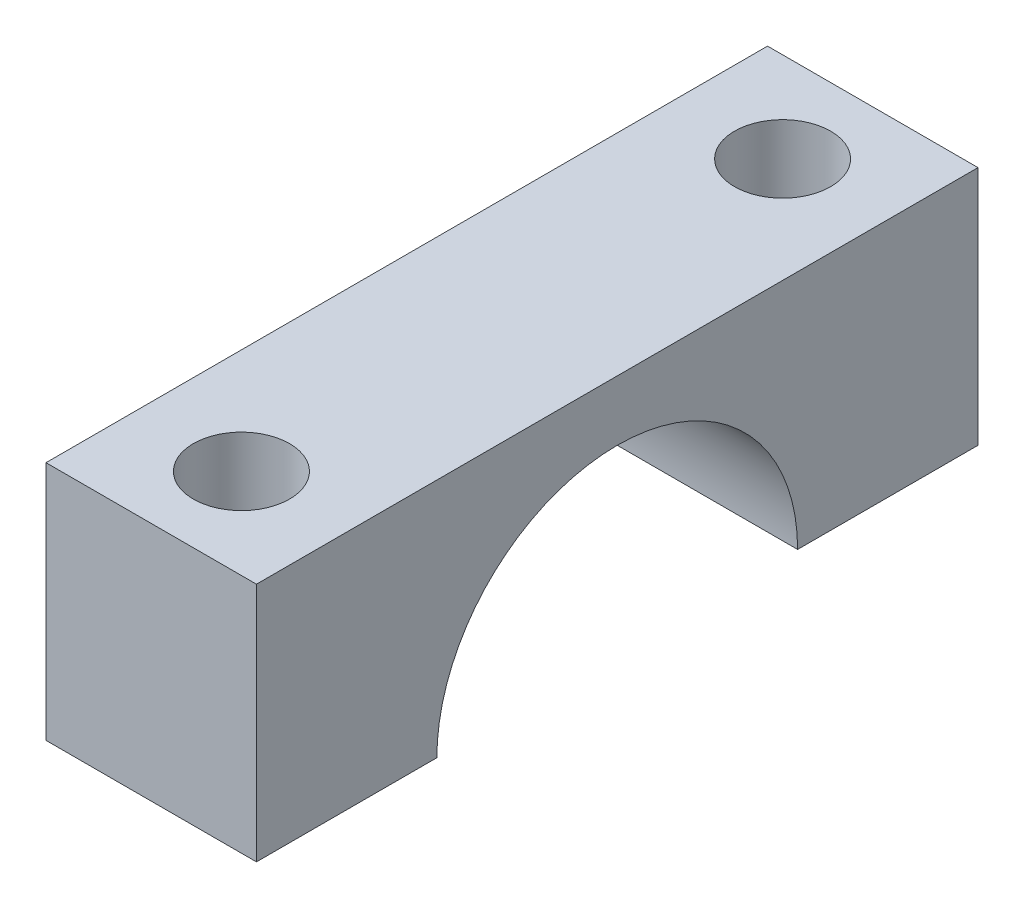
ISO-10303-21;
HEADER;
FILE_DESCRIPTION(('STEP AP214'),'2;1');
FILE_NAME('part.step','',(''),(''),'','','');
FILE_SCHEMA(('AUTOMOTIVE_DESIGN { 1 0 10303 214 1 1 1 1 }'));
ENDSEC;
DATA;
#1=APPLICATION_CONTEXT('core data for automotive mechanical design processes');
#2=APPLICATION_PROTOCOL_DEFINITION('international standard','automotive_design',2000,#1);
#3=PRODUCT_CONTEXT('',#1,'mechanical');
#4=PRODUCT('Part','Part','',(#3));
#5=PRODUCT_RELATED_PRODUCT_CATEGORY('part','',(#4));
#6=PRODUCT_DEFINITION_FORMATION('','',#4);
#7=PRODUCT_DEFINITION_CONTEXT('part definition',#1,'design');
#8=PRODUCT_DEFINITION('design','',#6,#7);
#9=PRODUCT_DEFINITION_SHAPE('','',#8);
#10=(LENGTH_UNIT() NAMED_UNIT(*) SI_UNIT(.MILLI.,.METRE.));
#11=(NAMED_UNIT(*) PLANE_ANGLE_UNIT() SI_UNIT($,.RADIAN.));
#12=(NAMED_UNIT(*) SI_UNIT($,.STERADIAN.) SOLID_ANGLE_UNIT());
#13=UNCERTAINTY_MEASURE_WITH_UNIT(LENGTH_MEASURE(1.E-05),#10,'distance_accuracy_value','');
#14=(GEOMETRIC_REPRESENTATION_CONTEXT(3) GLOBAL_UNCERTAINTY_ASSIGNED_CONTEXT((#13)) GLOBAL_UNIT_ASSIGNED_CONTEXT((#10,
#11,#12)) REPRESENTATION_CONTEXT('',''));
#15=CARTESIAN_POINT('',(0.,0.,0.));
#16=DIRECTION('',(0.,0.,1.));
#17=DIRECTION('',(1.,0.,0.));
#18=AXIS2_PLACEMENT_3D('',#15,#16,#17);
#19=CARTESIAN_POINT('',(0.,0.,0.));
#20=DIRECTION('',(0.,1.,0.));
#21=DIRECTION('',(0.,0.,1.));
#22=AXIS2_PLACEMENT_3D('',#19,#20,#21);
#23=PLANE('',#22);
#24=CARTESIAN_POINT('',(3.50000000000001,0.,3.));
#25=DIRECTION('',(0.,-1.,0.));
#26=DIRECTION('',(0.,0.,-1.));
#27=AXIS2_PLACEMENT_3D('',#24,#25,#26);
#28=CIRCLE('',#27,1.6);
#29=CARTESIAN_POINT('',(3.50000000000001,0.,1.4));
#30=VERTEX_POINT('',#29);
#31=EDGE_CURVE('E185',#30,#30,#28,.T.);
#32=ORIENTED_EDGE('',*,*,#31,.F.);
#33=EDGE_LOOP('',(#32));
#34=FACE_BOUND('',#33,.T.);
#35=DIRECTION('',(0.,0.,-1.));
#36=VECTOR('',#35,1.);
#37=CARTESIAN_POINT('',(7.,0.,0.));
#38=LINE('',#37,#36);
#39=CARTESIAN_POINT('',(7.,0.,6.));
#40=VERTEX_POINT('',#39);
#41=CARTESIAN_POINT('',(7.,0.,0.));
#42=VERTEX_POINT('',#41);
#43=EDGE_CURVE('E112',#40,#42,#38,.T.);
#44=ORIENTED_EDGE('',*,*,#43,.F.);
#45=DIRECTION('',(-1.,0.,0.));
#46=VECTOR('',#45,1.);
#47=CARTESIAN_POINT('',(23.9705627484771,0.,5.99999999999999));
#48=LINE('',#47,#46);
#49=CARTESIAN_POINT('',(0.,0.,6.));
#50=VERTEX_POINT('',#49);
#51=EDGE_CURVE('E11',#40,#50,#48,.T.);
#52=ORIENTED_EDGE('',*,*,#51,.T.);
#53=DIRECTION('',(0.,0.,1.));
#54=VECTOR('',#53,1.);
#55=CARTESIAN_POINT('',(0.,0.,0.));
#56=LINE('',#55,#54);
#57=CARTESIAN_POINT('',(0.,0.,0.));
#58=VERTEX_POINT('',#57);
#59=EDGE_CURVE('E120',#58,#50,#56,.T.);
#60=ORIENTED_EDGE('',*,*,#59,.F.);
#61=DIRECTION('',(-1.,0.,0.));
#62=VECTOR('',#61,1.);
#63=CARTESIAN_POINT('',(0.,0.,0.));
#64=LINE('',#63,#62);
#65=EDGE_CURVE('E86',#42,#58,#64,.T.);
#66=ORIENTED_EDGE('',*,*,#65,.F.);
#67=EDGE_LOOP('',(#44,#52,#60,#66));
#68=FACE_BOUND('',#67,.T.);
#69=ADVANCED_FACE('F41',(#34,#68),#23,.F.);
#70=CARTESIAN_POINT('',(0.,8.,0.));
#71=DIRECTION('',(1.,0.,0.));
#72=DIRECTION('',(0.,0.,-1.));
#73=AXIS2_PLACEMENT_3D('',#70,#71,#72);
#74=PLANE('',#73);
#75=ORIENTED_EDGE('',*,*,#59,.T.);
#76=CARTESIAN_POINT('',(0.,0.,12.));
#77=DIRECTION('',(-1.,0.,0.));
#78=DIRECTION('',(0.,0.,1.));
#79=AXIS2_PLACEMENT_3D('',#76,#77,#78);
#80=CIRCLE('',#79,6.);
#81=CARTESIAN_POINT('',(0.,0.,18.));
#82=VERTEX_POINT('',#81);
#83=EDGE_CURVE('E103',#82,#50,#80,.T.);
#84=ORIENTED_EDGE('',*,*,#83,.F.);
#85=CARTESIAN_POINT('',(0.,0.,24.));
#86=VERTEX_POINT('',#85);
#87=EDGE_CURVE('E116',#82,#86,#56,.T.);
#88=ORIENTED_EDGE('',*,*,#87,.T.);
#89=DIRECTION('',(0.,-1.,0.));
#90=VECTOR('',#89,1.);
#91=CARTESIAN_POINT('',(0.,8.,24.));
#92=LINE('',#91,#90);
#93=CARTESIAN_POINT('',(0.,8.,24.));
#94=VERTEX_POINT('',#93);
#95=EDGE_CURVE('E132',#94,#86,#92,.T.);
#96=ORIENTED_EDGE('',*,*,#95,.F.);
#97=DIRECTION('',(0.,0.,1.));
#98=VECTOR('',#97,1.);
#99=CARTESIAN_POINT('',(0.,8.,0.));
#100=LINE('',#99,#98);
#101=CARTESIAN_POINT('',(0.,8.,0.));
#102=VERTEX_POINT('',#101);
#103=EDGE_CURVE('E125',#102,#94,#100,.T.);
#104=ORIENTED_EDGE('',*,*,#103,.F.);
#105=DIRECTION('',(0.,-1.,0.));
#106=VECTOR('',#105,1.);
#107=CARTESIAN_POINT('',(0.,8.,0.));
#108=LINE('',#107,#106);
#109=EDGE_CURVE('E126',#102,#58,#108,.T.);
#110=ORIENTED_EDGE('',*,*,#109,.T.);
#111=EDGE_LOOP('',(#75,#84,#88,#96,#104,#110));
#112=FACE_BOUND('',#111,.T.);
#113=ADVANCED_FACE('F43',(#112),#74,.F.);
#114=CARTESIAN_POINT('',(0.,8.,24.));
#115=DIRECTION('',(0.,0.,-1.));
#116=DIRECTION('',(-1.,0.,0.));
#117=AXIS2_PLACEMENT_3D('',#114,#115,#116);
#118=PLANE('',#117);
#119=DIRECTION('',(1.,0.,0.));
#120=VECTOR('',#119,1.);
#121=CARTESIAN_POINT('',(0.,0.,24.));
#122=LINE('',#121,#120);
#123=CARTESIAN_POINT('',(7.,0.,24.));
#124=VERTEX_POINT('',#123);
#125=EDGE_CURVE('E118',#86,#124,#122,.T.);
#126=ORIENTED_EDGE('',*,*,#125,.T.);
#127=DIRECTION('',(0.,-1.,0.));
#128=VECTOR('',#127,1.);
#129=CARTESIAN_POINT('',(7.,8.,24.));
#130=LINE('',#129,#128);
#131=CARTESIAN_POINT('',(7.,8.,24.));
#132=VERTEX_POINT('',#131);
#133=EDGE_CURVE('E130',#132,#124,#130,.T.);
#134=ORIENTED_EDGE('',*,*,#133,.F.);
#135=DIRECTION('',(1.,0.,0.));
#136=VECTOR('',#135,1.);
#137=CARTESIAN_POINT('',(0.,8.,24.));
#138=LINE('',#137,#136);
#139=EDGE_CURVE('E94',#94,#132,#138,.T.);
#140=ORIENTED_EDGE('',*,*,#139,.F.);
#141=ORIENTED_EDGE('',*,*,#95,.T.);
#142=EDGE_LOOP('',(#126,#134,#140,#141));
#143=FACE_BOUND('',#142,.T.);
#144=ADVANCED_FACE('F156',(#143),#118,.F.);
#145=CARTESIAN_POINT('',(7.,8.,0.));
#146=DIRECTION('',(-1.,0.,0.));
#147=DIRECTION('',(0.,0.,1.));
#148=AXIS2_PLACEMENT_3D('',#145,#146,#147);
#149=PLANE('',#148);
#150=CARTESIAN_POINT('',(7.,0.,18.));
#151=VERTEX_POINT('',#150);
#152=EDGE_CURVE('E115',#124,#151,#38,.T.);
#153=ORIENTED_EDGE('',*,*,#152,.T.);
#154=CARTESIAN_POINT('',(7.,0.,12.));
#155=DIRECTION('',(-1.,0.,0.));
#156=DIRECTION('',(0.,0.,1.));
#157=AXIS2_PLACEMENT_3D('',#154,#155,#156);
#158=CIRCLE('',#157,6.);
#159=EDGE_CURVE('E56',#40,#151,#158,.F.);
#160=ORIENTED_EDGE('',*,*,#159,.F.);
#161=ORIENTED_EDGE('',*,*,#43,.T.);
#162=DIRECTION('',(0.,-1.,0.));
#163=VECTOR('',#162,1.);
#164=CARTESIAN_POINT('',(7.,8.,0.));
#165=LINE('',#164,#163);
#166=CARTESIAN_POINT('',(7.,8.,0.));
#167=VERTEX_POINT('',#166);
#168=EDGE_CURVE('E128',#167,#42,#165,.T.);
#169=ORIENTED_EDGE('',*,*,#168,.F.);
#170=DIRECTION('',(0.,0.,-1.));
#171=VECTOR('',#170,1.);
#172=CARTESIAN_POINT('',(7.,8.,0.));
#173=LINE('',#172,#171);
#174=EDGE_CURVE('E150',#132,#167,#173,.T.);
#175=ORIENTED_EDGE('',*,*,#174,.F.);
#176=ORIENTED_EDGE('',*,*,#133,.T.);
#177=EDGE_LOOP('',(#153,#160,#161,#169,#175,#176));
#178=FACE_BOUND('',#177,.T.);
#179=ADVANCED_FACE('F110',(#178),#149,.F.);
#180=CARTESIAN_POINT('',(0.,8.,0.));
#181=DIRECTION('',(0.,0.,1.));
#182=DIRECTION('',(1.,0.,0.));
#183=AXIS2_PLACEMENT_3D('',#180,#181,#182);
#184=PLANE('',#183);
#185=ORIENTED_EDGE('',*,*,#65,.T.);
#186=ORIENTED_EDGE('',*,*,#109,.F.);
#187=DIRECTION('',(-1.,0.,0.));
#188=VECTOR('',#187,1.);
#189=CARTESIAN_POINT('',(0.,8.,0.));
#190=LINE('',#189,#188);
#191=EDGE_CURVE('E65',#167,#102,#190,.T.);
#192=ORIENTED_EDGE('',*,*,#191,.F.);
#193=ORIENTED_EDGE('',*,*,#168,.T.);
#194=EDGE_LOOP('',(#185,#186,#192,#193));
#195=FACE_BOUND('',#194,.T.);
#196=ADVANCED_FACE('F154',(#195),#184,.F.);
#197=CARTESIAN_POINT('',(0.,8.,0.));
#198=DIRECTION('',(0.,1.,0.));
#199=DIRECTION('',(0.,0.,1.));
#200=AXIS2_PLACEMENT_3D('',#197,#198,#199);
#201=PLANE('',#200);
#202=CARTESIAN_POINT('',(3.5,8.,21.));
#203=DIRECTION('',(0.,-1.,0.));
#204=DIRECTION('',(0.,0.,-1.));
#205=AXIS2_PLACEMENT_3D('',#202,#203,#204);
#206=CIRCLE('',#205,1.6);
#207=CARTESIAN_POINT('',(3.5,8.,19.4));
#208=VERTEX_POINT('',#207);
#209=EDGE_CURVE('E139',#208,#208,#206,.T.);
#210=ORIENTED_EDGE('',*,*,#209,.T.);
#211=EDGE_LOOP('',(#210));
#212=FACE_BOUND('',#211,.T.);
#213=CARTESIAN_POINT('',(3.50000000000001,8.,3.));
#214=DIRECTION('',(0.,-1.,0.));
#215=DIRECTION('',(0.,0.,-1.));
#216=AXIS2_PLACEMENT_3D('',#213,#214,#215);
#217=CIRCLE('',#216,1.6);
#218=CARTESIAN_POINT('',(3.50000000000001,8.,1.4));
#219=VERTEX_POINT('',#218);
#220=EDGE_CURVE('E145',#219,#219,#217,.T.);
#221=ORIENTED_EDGE('',*,*,#220,.T.);
#222=EDGE_LOOP('',(#221));
#223=FACE_BOUND('',#222,.T.);
#224=ORIENTED_EDGE('',*,*,#103,.T.);
#225=ORIENTED_EDGE('',*,*,#139,.T.);
#226=ORIENTED_EDGE('',*,*,#174,.T.);
#227=ORIENTED_EDGE('',*,*,#191,.T.);
#228=EDGE_LOOP('',(#224,#225,#226,#227));
#229=FACE_BOUND('',#228,.T.);
#230=ADVANCED_FACE('F153',(#212,#223,#229),#201,.T.);
#231=CARTESIAN_POINT('',(3.5,0.,21.));
#232=DIRECTION('',(0.,-1.,0.));
#233=DIRECTION('',(0.,0.,-1.));
#234=AXIS2_PLACEMENT_3D('',#231,#232,#233);
#235=CIRCLE('',#234,1.6);
#236=CARTESIAN_POINT('',(3.5,0.,19.4));
#237=VERTEX_POINT('',#236);
#238=EDGE_CURVE('E142',#237,#237,#235,.T.);
#239=ORIENTED_EDGE('',*,*,#238,.F.);
#240=EDGE_LOOP('',(#239));
#241=FACE_BOUND('',#240,.T.);
#242=ORIENTED_EDGE('',*,*,#87,.F.);
#243=DIRECTION('',(-1.,0.,0.));
#244=VECTOR('',#243,1.);
#245=CARTESIAN_POINT('',(23.9705627484771,0.,18.));
#246=LINE('',#245,#244);
#247=EDGE_CURVE('E49',#82,#151,#246,.F.);
#248=ORIENTED_EDGE('',*,*,#247,.T.);
#249=ORIENTED_EDGE('',*,*,#152,.F.);
#250=ORIENTED_EDGE('',*,*,#125,.F.);
#251=EDGE_LOOP('',(#242,#248,#249,#250));
#252=FACE_BOUND('',#251,.T.);
#253=ADVANCED_FACE('F135',(#241,#252),#23,.F.);
#254=CARTESIAN_POINT('',(23.9705627484771,0.,12.));
#255=DIRECTION('',(-1.,0.,0.));
#256=DIRECTION('',(0.,0.,1.));
#257=AXIS2_PLACEMENT_3D('',#254,#255,#256);
#258=CYLINDRICAL_SURFACE('',#257,6.);
#259=ORIENTED_EDGE('',*,*,#159,.T.);
#260=ORIENTED_EDGE('',*,*,#247,.F.);
#261=ORIENTED_EDGE('',*,*,#83,.T.);
#262=ORIENTED_EDGE('',*,*,#51,.F.);
#263=EDGE_LOOP('',(#259,#260,#261,#262));
#264=FACE_BOUND('',#263,.T.);
#265=ADVANCED_FACE('F101',(#264),#258,.F.);
#266=CARTESIAN_POINT('',(3.5,8.,21.));
#267=DIRECTION('',(0.,-1.,0.));
#268=DIRECTION('',(0.,0.,-1.));
#269=AXIS2_PLACEMENT_3D('',#266,#267,#268);
#270=CYLINDRICAL_SURFACE('',#269,1.6);
#271=ORIENTED_EDGE('',*,*,#209,.F.);
#272=EDGE_LOOP('',(#271));
#273=FACE_BOUND('',#272,.T.);
#274=ORIENTED_EDGE('',*,*,#238,.T.);
#275=EDGE_LOOP('',(#274));
#276=FACE_BOUND('',#275,.T.);
#277=ADVANCED_FACE('F179',(#273,#276),#270,.F.);
#278=CARTESIAN_POINT('',(3.50000000000001,8.,3.));
#279=DIRECTION('',(0.,-1.,0.));
#280=DIRECTION('',(0.,0.,-1.));
#281=AXIS2_PLACEMENT_3D('',#278,#279,#280);
#282=CYLINDRICAL_SURFACE('',#281,1.6);
#283=ORIENTED_EDGE('',*,*,#220,.F.);
#284=EDGE_LOOP('',(#283));
#285=FACE_BOUND('',#284,.T.);
#286=ORIENTED_EDGE('',*,*,#31,.T.);
#287=EDGE_LOOP('',(#286));
#288=FACE_BOUND('',#287,.T.);
#289=ADVANCED_FACE('F193',(#285,#288),#282,.F.);
#290=CLOSED_SHELL('',(#69,#113,#144,#179,#196,#230,#253,#265,#277,#289));
#291=MANIFOLD_SOLID_BREP('B2',#290);
#292=ADVANCED_BREP_SHAPE_REPRESENTATION('',(#18,#291),#14);
#293=SHAPE_DEFINITION_REPRESENTATION(#9,#292);
ENDSEC;
END-ISO-10303-21;
